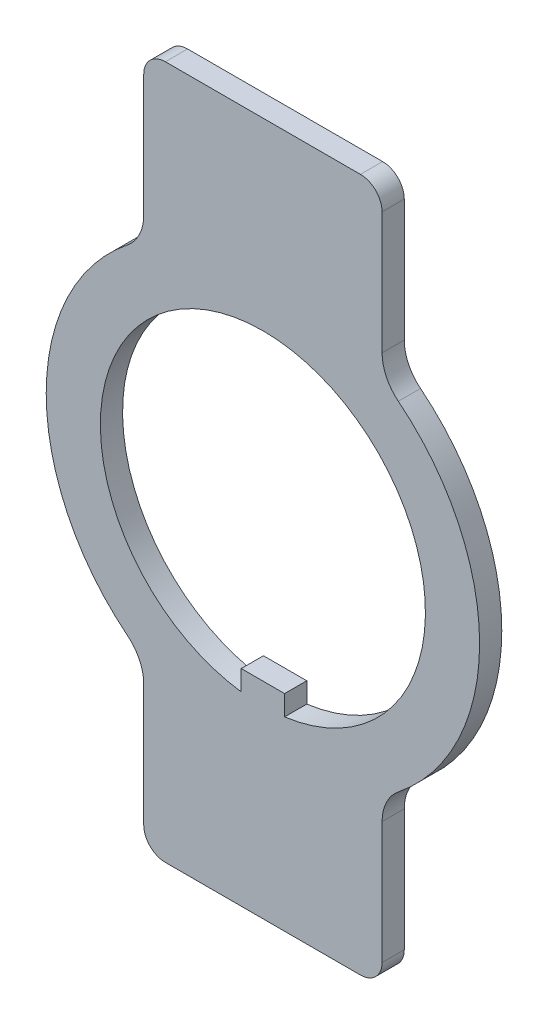
ISO-10303-21;
HEADER;
FILE_DESCRIPTION(('STEP AP214'),'2;1');
FILE_NAME('part.step','',(''),(''),'','','');
FILE_SCHEMA(('AUTOMOTIVE_DESIGN { 1 0 10303 214 1 1 1 1 }'));
ENDSEC;
DATA;
#1=APPLICATION_CONTEXT('core data for automotive mechanical design processes');
#2=APPLICATION_PROTOCOL_DEFINITION('international standard','automotive_design',2000,#1);
#3=PRODUCT_CONTEXT('',#1,'mechanical');
#4=PRODUCT('Part','Part','',(#3));
#5=PRODUCT_RELATED_PRODUCT_CATEGORY('part','',(#4));
#6=PRODUCT_DEFINITION_FORMATION('','',#4);
#7=PRODUCT_DEFINITION_CONTEXT('part definition',#1,'design');
#8=PRODUCT_DEFINITION('design','',#6,#7);
#9=PRODUCT_DEFINITION_SHAPE('','',#8);
#10=(LENGTH_UNIT() NAMED_UNIT(*) SI_UNIT(.MILLI.,.METRE.));
#11=(NAMED_UNIT(*) PLANE_ANGLE_UNIT() SI_UNIT($,.RADIAN.));
#12=(NAMED_UNIT(*) SI_UNIT($,.STERADIAN.) SOLID_ANGLE_UNIT());
#13=UNCERTAINTY_MEASURE_WITH_UNIT(LENGTH_MEASURE(1.E-05),#10,'distance_accuracy_value','');
#14=(GEOMETRIC_REPRESENTATION_CONTEXT(3) GLOBAL_UNCERTAINTY_ASSIGNED_CONTEXT((#13)) GLOBAL_UNIT_ASSIGNED_CONTEXT((#10,
#11,#12)) REPRESENTATION_CONTEXT('',''));
#15=CARTESIAN_POINT('',(0.,0.,0.));
#16=DIRECTION('',(0.,0.,1.));
#17=DIRECTION('',(1.,0.,0.));
#18=AXIS2_PLACEMENT_3D('',#15,#16,#17);
#19=CARTESIAN_POINT('',(0.,0.,0.8128));
#20=DIRECTION('',(0.,0.,1.));
#21=DIRECTION('',(1.,0.,0.));
#22=AXIS2_PLACEMENT_3D('',#19,#20,#21);
#23=PLANE('',#22);
#24=DIRECTION('',(-1.,0.,0.));
#25=VECTOR('',#24,1.);
#26=CARTESIAN_POINT('',(-4.365625,12.7,0.8128));
#27=LINE('',#26,#25);
#28=CARTESIAN_POINT('',(3.571875,12.7,0.8128));
#29=VERTEX_POINT('',#28);
#30=CARTESIAN_POINT('',(-3.571875,12.7,0.8128));
#31=VERTEX_POINT('',#30);
#32=EDGE_CURVE('E255',#29,#31,#27,.T.);
#33=ORIENTED_EDGE('',*,*,#32,.T.);
#34=CARTESIAN_POINT('',(-3.571875,11.90625,0.8128));
#35=DIRECTION('',(0.,0.,1.));
#36=DIRECTION('',(1.,0.,0.));
#37=AXIS2_PLACEMENT_3D('',#34,#35,#36);
#38=CIRCLE('',#37,0.79375);
#39=CARTESIAN_POINT('',(-4.365625,11.90625,0.8128));
#40=VERTEX_POINT('',#39);
#41=EDGE_CURVE('E302',#31,#40,#38,.T.);
#42=ORIENTED_EDGE('',*,*,#41,.T.);
#43=DIRECTION('',(0.,-1.,0.));
#44=VECTOR('',#43,1.);
#45=CARTESIAN_POINT('',(-4.365625,12.7,0.8128));
#46=LINE('',#45,#44);
#47=CARTESIAN_POINT('',(-4.365625,7.4354507418431,0.8128));
#48=VERTEX_POINT('',#47);
#49=EDGE_CURVE('E236',#40,#48,#46,.T.);
#50=ORIENTED_EDGE('',*,*,#49,.T.);
#51=CARTESIAN_POINT('',(-5.953125,7.43545074184309,0.8128));
#52=DIRECTION('',(0.,0.,1.));
#53=DIRECTION('',(1.,0.,0.));
#54=AXIS2_PLACEMENT_3D('',#51,#52,#53);
#55=CIRCLE('',#54,1.5875);
#56=CARTESIAN_POINT('',(-4.9609375,6.19620895153591,0.8128));
#57=VERTEX_POINT('',#56);
#58=EDGE_CURVE('E339',#48,#57,#55,.F.);
#59=ORIENTED_EDGE('',*,*,#58,.T.);
#60=CARTESIAN_POINT('',(0.,0.,0.8128));
#61=DIRECTION('',(0.,0.,1.));
#62=DIRECTION('',(1.,0.,0.));
#63=AXIS2_PLACEMENT_3D('',#60,#61,#62);
#64=CIRCLE('',#63,7.9375);
#65=CARTESIAN_POINT('',(-4.9609375,-6.19620895153591,0.8128));
#66=VERTEX_POINT('',#65);
#67=EDGE_CURVE('E239',#57,#66,#64,.T.);
#68=ORIENTED_EDGE('',*,*,#67,.T.);
#69=CARTESIAN_POINT('',(-5.953125,-7.43545074184309,0.8128));
#70=DIRECTION('',(0.,0.,1.));
#71=DIRECTION('',(1.,0.,0.));
#72=AXIS2_PLACEMENT_3D('',#69,#70,#71);
#73=CIRCLE('',#72,1.5875);
#74=CARTESIAN_POINT('',(-4.365625,-7.43545074184309,0.8128));
#75=VERTEX_POINT('',#74);
#76=EDGE_CURVE('E14',#66,#75,#73,.F.);
#77=ORIENTED_EDGE('',*,*,#76,.T.);
#78=DIRECTION('',(0.,-1.,0.));
#79=VECTOR('',#78,1.);
#80=CARTESIAN_POINT('',(-4.365625,-6.62911944449449,0.8128));
#81=LINE('',#80,#79);
#82=CARTESIAN_POINT('',(-4.365625,-11.90625,0.8128));
#83=VERTEX_POINT('',#82);
#84=EDGE_CURVE('E242',#75,#83,#81,.T.);
#85=ORIENTED_EDGE('',*,*,#84,.T.);
#86=CARTESIAN_POINT('',(-3.571875,-11.90625,0.8128));
#87=DIRECTION('',(0.,0.,1.));
#88=DIRECTION('',(1.,0.,0.));
#89=AXIS2_PLACEMENT_3D('',#86,#87,#88);
#90=CIRCLE('',#89,0.79375);
#91=CARTESIAN_POINT('',(-3.571875,-12.7,0.8128));
#92=VERTEX_POINT('',#91);
#93=EDGE_CURVE('E296',#83,#92,#90,.T.);
#94=ORIENTED_EDGE('',*,*,#93,.T.);
#95=DIRECTION('',(1.,0.,0.));
#96=VECTOR('',#95,1.);
#97=CARTESIAN_POINT('',(-4.365625,-12.7,0.8128));
#98=LINE('',#97,#96);
#99=CARTESIAN_POINT('',(3.571875,-12.7,0.8128));
#100=VERTEX_POINT('',#99);
#101=EDGE_CURVE('E244',#92,#100,#98,.T.);
#102=ORIENTED_EDGE('',*,*,#101,.T.);
#103=CARTESIAN_POINT('',(3.571875,-11.90625,0.8128));
#104=DIRECTION('',(0.,0.,1.));
#105=DIRECTION('',(1.,0.,0.));
#106=AXIS2_PLACEMENT_3D('',#103,#104,#105);
#107=CIRCLE('',#106,0.79375);
#108=CARTESIAN_POINT('',(4.365625,-11.90625,0.8128));
#109=VERTEX_POINT('',#108);
#110=EDGE_CURVE('E298',#100,#109,#107,.T.);
#111=ORIENTED_EDGE('',*,*,#110,.T.);
#112=DIRECTION('',(0.,1.,0.));
#113=VECTOR('',#112,1.);
#114=CARTESIAN_POINT('',(4.365625,-12.7,0.8128));
#115=LINE('',#114,#113);
#116=CARTESIAN_POINT('',(4.365625,-7.43545074184309,0.8128));
#117=VERTEX_POINT('',#116);
#118=EDGE_CURVE('E247',#109,#117,#115,.T.);
#119=ORIENTED_EDGE('',*,*,#118,.T.);
#120=CARTESIAN_POINT('',(5.953125,-7.43545074184309,0.8128));
#121=DIRECTION('',(0.,0.,1.));
#122=DIRECTION('',(1.,0.,0.));
#123=AXIS2_PLACEMENT_3D('',#120,#121,#122);
#124=CIRCLE('',#123,1.5875);
#125=CARTESIAN_POINT('',(4.9609375,-6.19620895153591,0.8128));
#126=VERTEX_POINT('',#125);
#127=EDGE_CURVE('E347',#117,#126,#124,.F.);
#128=ORIENTED_EDGE('',*,*,#127,.T.);
#129=CARTESIAN_POINT('',(0.,0.,0.8128));
#130=DIRECTION('',(0.,0.,1.));
#131=DIRECTION('',(1.,0.,0.));
#132=AXIS2_PLACEMENT_3D('',#129,#130,#131);
#133=CIRCLE('',#132,7.9375);
#134=CARTESIAN_POINT('',(4.9609375,6.19620895153591,0.8128));
#135=VERTEX_POINT('',#134);
#136=EDGE_CURVE('E250',#126,#135,#133,.T.);
#137=ORIENTED_EDGE('',*,*,#136,.T.);
#138=CARTESIAN_POINT('',(5.953125,7.43545074184309,0.8128));
#139=DIRECTION('',(0.,0.,1.));
#140=DIRECTION('',(1.,0.,0.));
#141=AXIS2_PLACEMENT_3D('',#138,#139,#140);
#142=CIRCLE('',#141,1.5875);
#143=CARTESIAN_POINT('',(4.365625,7.43545074184309,0.8128));
#144=VERTEX_POINT('',#143);
#145=EDGE_CURVE('E343',#135,#144,#142,.F.);
#146=ORIENTED_EDGE('',*,*,#145,.T.);
#147=DIRECTION('',(0.,1.,0.));
#148=VECTOR('',#147,1.);
#149=CARTESIAN_POINT('',(4.365625,6.6291194444945,0.8128));
#150=LINE('',#149,#148);
#151=CARTESIAN_POINT('',(4.365625,11.90625,0.8128));
#152=VERTEX_POINT('',#151);
#153=EDGE_CURVE('E253',#144,#152,#150,.T.);
#154=ORIENTED_EDGE('',*,*,#153,.T.);
#155=CARTESIAN_POINT('',(3.571875,11.90625,0.8128));
#156=DIRECTION('',(0.,0.,1.));
#157=DIRECTION('',(1.,0.,0.));
#158=AXIS2_PLACEMENT_3D('',#155,#156,#157);
#159=CIRCLE('',#158,0.79375);
#160=EDGE_CURVE('E300',#152,#29,#159,.T.);
#161=ORIENTED_EDGE('',*,*,#160,.T.);
#162=EDGE_LOOP('',(#33,#42,#50,#59,#68,#77,#85,#94,#102,#111,#119,#128,#137,#146,#154,#161));
#163=FACE_BOUND('',#162,.T.);
#164=DIRECTION('',(0.,1.,0.));
#165=VECTOR('',#164,1.);
#166=CARTESIAN_POINT('',(-0.793749999999996,-5.89997103409203,0.8128));
#167=LINE('',#166,#165);
#168=CARTESIAN_POINT('',(-0.793749999999996,-5.89997103409203,0.8128));
#169=VERTEX_POINT('',#168);
#170=CARTESIAN_POINT('',(-0.793749999999996,-5.159375,0.8128));
#171=VERTEX_POINT('',#170);
#172=EDGE_CURVE('E205',#169,#171,#167,.T.);
#173=ORIENTED_EDGE('',*,*,#172,.F.);
#174=CARTESIAN_POINT('',(0.,0.,0.8128));
#175=DIRECTION('',(0.,0.,1.));
#176=DIRECTION('',(-1.,0.,0.));
#177=AXIS2_PLACEMENT_3D('',#174,#175,#176);
#178=CIRCLE('',#177,5.953125);
#179=CARTESIAN_POINT('',(0.793750000000004,-5.89997103409203,0.8128));
#180=VERTEX_POINT('',#179);
#181=EDGE_CURVE('E195',#180,#169,#178,.T.);
#182=ORIENTED_EDGE('',*,*,#181,.F.);
#183=DIRECTION('',(0.,-1.,0.));
#184=VECTOR('',#183,1.);
#185=CARTESIAN_POINT('',(0.793750000000004,-5.159375,0.8128));
#186=LINE('',#185,#184);
#187=CARTESIAN_POINT('',(0.793750000000004,-5.159375,0.8128));
#188=VERTEX_POINT('',#187);
#189=EDGE_CURVE('E220',#188,#180,#186,.T.);
#190=ORIENTED_EDGE('',*,*,#189,.F.);
#191=DIRECTION('',(1.,0.,0.));
#192=VECTOR('',#191,1.);
#193=CARTESIAN_POINT('',(-0.793749999999996,-5.159375,0.8128));
#194=LINE('',#193,#192);
#195=EDGE_CURVE('E218',#171,#188,#194,.T.);
#196=ORIENTED_EDGE('',*,*,#195,.F.);
#197=EDGE_LOOP('',(#173,#182,#190,#196));
#198=FACE_BOUND('',#197,.T.);
#199=ADVANCED_FACE('F58',(#163,#198),#23,.T.);
#200=CARTESIAN_POINT('',(0.,0.,0.));
#201=DIRECTION('',(0.,0.,1.));
#202=DIRECTION('',(1.,0.,0.));
#203=AXIS2_PLACEMENT_3D('',#200,#201,#202);
#204=PLANE('',#203);
#205=DIRECTION('',(0.,-1.,0.));
#206=VECTOR('',#205,1.);
#207=CARTESIAN_POINT('',(-4.365625,12.7,0.));
#208=LINE('',#207,#206);
#209=CARTESIAN_POINT('',(-4.365625,11.90625,0.));
#210=VERTEX_POINT('',#209);
#211=CARTESIAN_POINT('',(-4.365625,7.4354507418431,0.));
#212=VERTEX_POINT('',#211);
#213=EDGE_CURVE('E213',#210,#212,#208,.T.);
#214=ORIENTED_EDGE('',*,*,#213,.F.);
#215=CARTESIAN_POINT('',(-3.571875,11.90625,0.));
#216=DIRECTION('',(0.,0.,1.));
#217=DIRECTION('',(1.,0.,0.));
#218=AXIS2_PLACEMENT_3D('',#215,#216,#217);
#219=CIRCLE('',#218,0.79375);
#220=CARTESIAN_POINT('',(-3.571875,12.7,0.));
#221=VERTEX_POINT('',#220);
#222=EDGE_CURVE('E289',#210,#221,#219,.F.);
#223=ORIENTED_EDGE('',*,*,#222,.T.);
#224=DIRECTION('',(-1.,0.,0.));
#225=VECTOR('',#224,1.);
#226=CARTESIAN_POINT('',(-4.365625,12.7,0.));
#227=LINE('',#226,#225);
#228=CARTESIAN_POINT('',(3.571875,12.7,0.));
#229=VERTEX_POINT('',#228);
#230=EDGE_CURVE('E240',#229,#221,#227,.T.);
#231=ORIENTED_EDGE('',*,*,#230,.F.);
#232=CARTESIAN_POINT('',(3.571875,11.90625,0.));
#233=DIRECTION('',(0.,0.,1.));
#234=DIRECTION('',(1.,0.,0.));
#235=AXIS2_PLACEMENT_3D('',#232,#233,#234);
#236=CIRCLE('',#235,0.79375);
#237=CARTESIAN_POINT('',(4.365625,11.90625,0.));
#238=VERTEX_POINT('',#237);
#239=EDGE_CURVE('E286',#229,#238,#236,.F.);
#240=ORIENTED_EDGE('',*,*,#239,.T.);
#241=DIRECTION('',(0.,1.,0.));
#242=VECTOR('',#241,1.);
#243=CARTESIAN_POINT('',(4.365625,6.6291194444945,0.));
#244=LINE('',#243,#242);
#245=CARTESIAN_POINT('',(4.365625,7.43545074184309,0.));
#246=VERTEX_POINT('',#245);
#247=EDGE_CURVE('E275',#246,#238,#244,.T.);
#248=ORIENTED_EDGE('',*,*,#247,.F.);
#249=CARTESIAN_POINT('',(5.953125,7.43545074184309,0.));
#250=DIRECTION('',(0.,0.,1.));
#251=DIRECTION('',(1.,0.,0.));
#252=AXIS2_PLACEMENT_3D('',#249,#250,#251);
#253=CIRCLE('',#252,1.5875);
#254=CARTESIAN_POINT('',(4.9609375,6.19620895153591,0.));
#255=VERTEX_POINT('',#254);
#256=EDGE_CURVE('E341',#246,#255,#253,.T.);
#257=ORIENTED_EDGE('',*,*,#256,.T.);
#258=CARTESIAN_POINT('',(0.,0.,0.));
#259=DIRECTION('',(0.,0.,1.));
#260=DIRECTION('',(1.,0.,0.));
#261=AXIS2_PLACEMENT_3D('',#258,#259,#260);
#262=CIRCLE('',#261,7.9375);
#263=CARTESIAN_POINT('',(4.9609375,-6.19620895153591,0.));
#264=VERTEX_POINT('',#263);
#265=EDGE_CURVE('E272',#264,#255,#262,.T.);
#266=ORIENTED_EDGE('',*,*,#265,.F.);
#267=CARTESIAN_POINT('',(5.953125,-7.43545074184309,0.));
#268=DIRECTION('',(0.,0.,1.));
#269=DIRECTION('',(1.,0.,0.));
#270=AXIS2_PLACEMENT_3D('',#267,#268,#269);
#271=CIRCLE('',#270,1.5875);
#272=CARTESIAN_POINT('',(4.365625,-7.43545074184309,0.));
#273=VERTEX_POINT('',#272);
#274=EDGE_CURVE('E345',#264,#273,#271,.T.);
#275=ORIENTED_EDGE('',*,*,#274,.T.);
#276=DIRECTION('',(0.,1.,0.));
#277=VECTOR('',#276,1.);
#278=CARTESIAN_POINT('',(4.365625,-12.7,0.));
#279=LINE('',#278,#277);
#280=CARTESIAN_POINT('',(4.365625,-11.90625,0.));
#281=VERTEX_POINT('',#280);
#282=EDGE_CURVE('E269',#281,#273,#279,.T.);
#283=ORIENTED_EDGE('',*,*,#282,.F.);
#284=CARTESIAN_POINT('',(3.571875,-11.90625,0.));
#285=DIRECTION('',(0.,0.,1.));
#286=DIRECTION('',(1.,0.,0.));
#287=AXIS2_PLACEMENT_3D('',#284,#285,#286);
#288=CIRCLE('',#287,0.79375);
#289=CARTESIAN_POINT('',(3.571875,-12.7,0.));
#290=VERTEX_POINT('',#289);
#291=EDGE_CURVE('E284',#281,#290,#288,.F.);
#292=ORIENTED_EDGE('',*,*,#291,.T.);
#293=DIRECTION('',(1.,0.,0.));
#294=VECTOR('',#293,1.);
#295=CARTESIAN_POINT('',(-4.365625,-12.7,0.));
#296=LINE('',#295,#294);
#297=CARTESIAN_POINT('',(-3.571875,-12.7,0.));
#298=VERTEX_POINT('',#297);
#299=EDGE_CURVE('E266',#298,#290,#296,.T.);
#300=ORIENTED_EDGE('',*,*,#299,.F.);
#301=CARTESIAN_POINT('',(-3.571875,-11.90625,0.));
#302=DIRECTION('',(0.,0.,1.));
#303=DIRECTION('',(1.,0.,0.));
#304=AXIS2_PLACEMENT_3D('',#301,#302,#303);
#305=CIRCLE('',#304,0.79375);
#306=CARTESIAN_POINT('',(-4.365625,-11.90625,0.));
#307=VERTEX_POINT('',#306);
#308=EDGE_CURVE('E281',#298,#307,#305,.F.);
#309=ORIENTED_EDGE('',*,*,#308,.T.);
#310=DIRECTION('',(0.,-1.,0.));
#311=VECTOR('',#310,1.);
#312=CARTESIAN_POINT('',(-4.365625,-6.62911944449449,0.));
#313=LINE('',#312,#311);
#314=CARTESIAN_POINT('',(-4.365625,-7.43545074184309,0.));
#315=VERTEX_POINT('',#314);
#316=EDGE_CURVE('E264',#315,#307,#313,.T.);
#317=ORIENTED_EDGE('',*,*,#316,.F.);
#318=CARTESIAN_POINT('',(-5.953125,-7.43545074184309,0.));
#319=DIRECTION('',(0.,0.,1.));
#320=DIRECTION('',(1.,0.,0.));
#321=AXIS2_PLACEMENT_3D('',#318,#319,#320);
#322=CIRCLE('',#321,1.5875);
#323=CARTESIAN_POINT('',(-4.9609375,-6.19620895153591,0.));
#324=VERTEX_POINT('',#323);
#325=EDGE_CURVE('E66',#315,#324,#322,.T.);
#326=ORIENTED_EDGE('',*,*,#325,.T.);
#327=CARTESIAN_POINT('',(0.,0.,0.));
#328=DIRECTION('',(0.,0.,1.));
#329=DIRECTION('',(1.,0.,0.));
#330=AXIS2_PLACEMENT_3D('',#327,#328,#329);
#331=CIRCLE('',#330,7.9375);
#332=CARTESIAN_POINT('',(-4.9609375,6.19620895153591,0.));
#333=VERTEX_POINT('',#332);
#334=EDGE_CURVE('E261',#333,#324,#331,.T.);
#335=ORIENTED_EDGE('',*,*,#334,.F.);
#336=CARTESIAN_POINT('',(-5.953125,7.43545074184309,0.));
#337=DIRECTION('',(0.,0.,1.));
#338=DIRECTION('',(1.,0.,0.));
#339=AXIS2_PLACEMENT_3D('',#336,#337,#338);
#340=CIRCLE('',#339,1.5875);
#341=EDGE_CURVE('E337',#333,#212,#340,.T.);
#342=ORIENTED_EDGE('',*,*,#341,.T.);
#343=EDGE_LOOP('',(#214,#223,#231,#240,#248,#257,#266,#275,#283,#292,#300,#309,#317,#326,#335,#342));
#344=FACE_BOUND('',#343,.T.);
#345=CARTESIAN_POINT('',(0.,0.,0.));
#346=DIRECTION('',(0.,0.,1.));
#347=DIRECTION('',(-1.,0.,0.));
#348=AXIS2_PLACEMENT_3D('',#345,#346,#347);
#349=CIRCLE('',#348,5.953125);
#350=CARTESIAN_POINT('',(0.793750000000004,-5.89997103409203,0.));
#351=VERTEX_POINT('',#350);
#352=CARTESIAN_POINT('',(-0.793749999999996,-5.89997103409203,0.));
#353=VERTEX_POINT('',#352);
#354=EDGE_CURVE('E224',#351,#353,#349,.T.);
#355=ORIENTED_EDGE('',*,*,#354,.T.);
#356=DIRECTION('',(0.,1.,0.));
#357=VECTOR('',#356,1.);
#358=CARTESIAN_POINT('',(-0.793749999999996,-5.89997103409203,0.));
#359=LINE('',#358,#357);
#360=CARTESIAN_POINT('',(-0.793749999999996,-5.159375,0.));
#361=VERTEX_POINT('',#360);
#362=EDGE_CURVE('E212',#353,#361,#359,.T.);
#363=ORIENTED_EDGE('',*,*,#362,.T.);
#364=DIRECTION('',(1.,0.,0.));
#365=VECTOR('',#364,1.);
#366=CARTESIAN_POINT('',(-0.793749999999996,-5.159375,0.));
#367=LINE('',#366,#365);
#368=CARTESIAN_POINT('',(0.793750000000004,-5.159375,0.));
#369=VERTEX_POINT('',#368);
#370=EDGE_CURVE('E227',#361,#369,#367,.T.);
#371=ORIENTED_EDGE('',*,*,#370,.T.);
#372=DIRECTION('',(0.,-1.,0.));
#373=VECTOR('',#372,1.);
#374=CARTESIAN_POINT('',(0.793750000000004,-5.159375,0.));
#375=LINE('',#374,#373);
#376=EDGE_CURVE('E206',#369,#351,#375,.T.);
#377=ORIENTED_EDGE('',*,*,#376,.T.);
#378=EDGE_LOOP('',(#355,#363,#371,#377));
#379=FACE_BOUND('',#378,.T.);
#380=ADVANCED_FACE('F352',(#344,#379),#204,.F.);
#381=CARTESIAN_POINT('',(-4.365625,12.7,0.8128));
#382=DIRECTION('',(1.,0.,0.));
#383=DIRECTION('',(0.,1.,0.));
#384=AXIS2_PLACEMENT_3D('',#381,#382,#383);
#385=PLANE('',#384);
#386=ORIENTED_EDGE('',*,*,#213,.T.);
#387=DIRECTION('',(0.,0.,1.));
#388=VECTOR('',#387,1.);
#389=CARTESIAN_POINT('',(-4.365625,7.43545074184309,0.8128));
#390=LINE('',#389,#388);
#391=EDGE_CURVE('E323',#212,#48,#390,.T.);
#392=ORIENTED_EDGE('',*,*,#391,.T.);
#393=ORIENTED_EDGE('',*,*,#49,.F.);
#394=DIRECTION('',(0.,0.,-1.));
#395=VECTOR('',#394,1.);
#396=CARTESIAN_POINT('',(-4.365625,11.90625,0.8128));
#397=LINE('',#396,#395);
#398=EDGE_CURVE('E258',#40,#210,#397,.T.);
#399=ORIENTED_EDGE('',*,*,#398,.T.);
#400=EDGE_LOOP('',(#386,#392,#393,#399));
#401=FACE_BOUND('',#400,.T.);
#402=ADVANCED_FACE('F413',(#401),#385,.F.);
#403=CARTESIAN_POINT('',(0.,0.,0.8128));
#404=DIRECTION('',(0.,0.,-1.));
#405=DIRECTION('',(-1.,0.,0.));
#406=AXIS2_PLACEMENT_3D('',#403,#404,#405);
#407=CYLINDRICAL_SURFACE('',#406,7.9375);
#408=ORIENTED_EDGE('',*,*,#67,.F.);
#409=DIRECTION('',(0.,0.,-1.));
#410=VECTOR('',#409,1.);
#411=CARTESIAN_POINT('',(-4.9609375,6.19620895153591,0.8128));
#412=LINE('',#411,#410);
#413=EDGE_CURVE('E320',#57,#333,#412,.T.);
#414=ORIENTED_EDGE('',*,*,#413,.T.);
#415=ORIENTED_EDGE('',*,*,#334,.T.);
#416=DIRECTION('',(0.,0.,-1.));
#417=VECTOR('',#416,1.);
#418=CARTESIAN_POINT('',(-4.9609375,-6.19620895153591,0.8128));
#419=LINE('',#418,#417);
#420=EDGE_CURVE('E318',#324,#66,#419,.F.);
#421=ORIENTED_EDGE('',*,*,#420,.T.);
#422=EDGE_LOOP('',(#408,#414,#415,#421));
#423=FACE_BOUND('',#422,.T.);
#424=ADVANCED_FACE('F356',(#423),#407,.T.);
#425=CARTESIAN_POINT('',(-4.365625,-6.62911944449449,0.8128));
#426=DIRECTION('',(1.,0.,0.));
#427=DIRECTION('',(0.,1.,0.));
#428=AXIS2_PLACEMENT_3D('',#425,#426,#427);
#429=PLANE('',#428);
#430=ORIENTED_EDGE('',*,*,#84,.F.);
#431=DIRECTION('',(0.,0.,1.));
#432=VECTOR('',#431,1.);
#433=CARTESIAN_POINT('',(-4.365625,-7.43545074184309,0.));
#434=LINE('',#433,#432);
#435=EDGE_CURVE('E335',#75,#315,#434,.F.);
#436=ORIENTED_EDGE('',*,*,#435,.T.);
#437=ORIENTED_EDGE('',*,*,#316,.T.);
#438=DIRECTION('',(0.,0.,-1.));
#439=VECTOR('',#438,1.);
#440=CARTESIAN_POINT('',(-4.365625,-11.90625,0.8128));
#441=LINE('',#440,#439);
#442=EDGE_CURVE('E315',#307,#83,#441,.F.);
#443=ORIENTED_EDGE('',*,*,#442,.T.);
#444=EDGE_LOOP('',(#430,#436,#437,#443));
#445=FACE_BOUND('',#444,.T.);
#446=ADVANCED_FACE('F359',(#445),#429,.F.);
#447=CARTESIAN_POINT('',(-4.365625,-12.7,0.8128));
#448=DIRECTION('',(0.,1.,0.));
#449=DIRECTION('',(-1.,0.,0.));
#450=AXIS2_PLACEMENT_3D('',#447,#448,#449);
#451=PLANE('',#450);
#452=ORIENTED_EDGE('',*,*,#299,.T.);
#453=DIRECTION('',(0.,0.,-1.));
#454=VECTOR('',#453,1.);
#455=CARTESIAN_POINT('',(3.571875,-12.7,0.8128));
#456=LINE('',#455,#454);
#457=EDGE_CURVE('E313',#290,#100,#456,.F.);
#458=ORIENTED_EDGE('',*,*,#457,.T.);
#459=ORIENTED_EDGE('',*,*,#101,.F.);
#460=DIRECTION('',(0.,0.,-1.));
#461=VECTOR('',#460,1.);
#462=CARTESIAN_POINT('',(-3.571875,-12.7,0.8128));
#463=LINE('',#462,#461);
#464=EDGE_CURVE('E310',#92,#298,#463,.T.);
#465=ORIENTED_EDGE('',*,*,#464,.T.);
#466=EDGE_LOOP('',(#452,#458,#459,#465));
#467=FACE_BOUND('',#466,.T.);
#468=ADVANCED_FACE('F367',(#467),#451,.F.);
#469=CARTESIAN_POINT('',(4.365625,-12.7,0.8128));
#470=DIRECTION('',(-1.,0.,0.));
#471=DIRECTION('',(0.,-1.,0.));
#472=AXIS2_PLACEMENT_3D('',#469,#470,#471);
#473=PLANE('',#472);
#474=ORIENTED_EDGE('',*,*,#282,.T.);
#475=DIRECTION('',(0.,0.,1.));
#476=VECTOR('',#475,1.);
#477=CARTESIAN_POINT('',(4.365625,-7.43545074184309,0.8128));
#478=LINE('',#477,#476);
#479=EDGE_CURVE('E333',#273,#117,#478,.T.);
#480=ORIENTED_EDGE('',*,*,#479,.T.);
#481=ORIENTED_EDGE('',*,*,#118,.F.);
#482=DIRECTION('',(0.,0.,-1.));
#483=VECTOR('',#482,1.);
#484=CARTESIAN_POINT('',(4.365625,-11.90625,0.8128));
#485=LINE('',#484,#483);
#486=EDGE_CURVE('E307',#109,#281,#485,.T.);
#487=ORIENTED_EDGE('',*,*,#486,.T.);
#488=EDGE_LOOP('',(#474,#480,#481,#487));
#489=FACE_BOUND('',#488,.T.);
#490=ADVANCED_FACE('F378',(#489),#473,.F.);
#491=CARTESIAN_POINT('',(0.,0.,0.8128));
#492=DIRECTION('',(0.,0.,-1.));
#493=DIRECTION('',(-1.,0.,0.));
#494=AXIS2_PLACEMENT_3D('',#491,#492,#493);
#495=CYLINDRICAL_SURFACE('',#494,7.9375);
#496=ORIENTED_EDGE('',*,*,#265,.T.);
#497=DIRECTION('',(0.,0.,-1.));
#498=VECTOR('',#497,1.);
#499=CARTESIAN_POINT('',(4.9609375,6.19620895153591,0.8128));
#500=LINE('',#499,#498);
#501=EDGE_CURVE('E331',#255,#135,#500,.F.);
#502=ORIENTED_EDGE('',*,*,#501,.T.);
#503=ORIENTED_EDGE('',*,*,#136,.F.);
#504=DIRECTION('',(0.,0.,-1.));
#505=VECTOR('',#504,1.);
#506=CARTESIAN_POINT('',(4.9609375,-6.19620895153591,0.8128));
#507=LINE('',#506,#505);
#508=EDGE_CURVE('E328',#126,#264,#507,.T.);
#509=ORIENTED_EDGE('',*,*,#508,.T.);
#510=EDGE_LOOP('',(#496,#502,#503,#509));
#511=FACE_BOUND('',#510,.T.);
#512=ADVANCED_FACE('F386',(#511),#495,.T.);
#513=CARTESIAN_POINT('',(4.365625,6.6291194444945,0.8128));
#514=DIRECTION('',(-1.,0.,0.));
#515=DIRECTION('',(0.,-1.,0.));
#516=AXIS2_PLACEMENT_3D('',#513,#514,#515);
#517=PLANE('',#516);
#518=ORIENTED_EDGE('',*,*,#153,.F.);
#519=DIRECTION('',(0.,0.,1.));
#520=VECTOR('',#519,1.);
#521=CARTESIAN_POINT('',(4.365625,7.43545074184309,0.));
#522=LINE('',#521,#520);
#523=EDGE_CURVE('E325',#144,#246,#522,.F.);
#524=ORIENTED_EDGE('',*,*,#523,.T.);
#525=ORIENTED_EDGE('',*,*,#247,.T.);
#526=DIRECTION('',(0.,0.,-1.));
#527=VECTOR('',#526,1.);
#528=CARTESIAN_POINT('',(4.365625,11.90625,0.8128));
#529=LINE('',#528,#527);
#530=EDGE_CURVE('E304',#238,#152,#529,.F.);
#531=ORIENTED_EDGE('',*,*,#530,.T.);
#532=EDGE_LOOP('',(#518,#524,#525,#531));
#533=FACE_BOUND('',#532,.T.);
#534=ADVANCED_FACE('F394',(#533),#517,.F.);
#535=CARTESIAN_POINT('',(-4.365625,12.7,0.8128));
#536=DIRECTION('',(0.,-1.,0.));
#537=DIRECTION('',(1.,0.,0.));
#538=AXIS2_PLACEMENT_3D('',#535,#536,#537);
#539=PLANE('',#538);
#540=ORIENTED_EDGE('',*,*,#230,.T.);
#541=DIRECTION('',(0.,0.,-1.));
#542=VECTOR('',#541,1.);
#543=CARTESIAN_POINT('',(-3.571875,12.7,0.8128));
#544=LINE('',#543,#542);
#545=EDGE_CURVE('E294',#221,#31,#544,.F.);
#546=ORIENTED_EDGE('',*,*,#545,.T.);
#547=ORIENTED_EDGE('',*,*,#32,.F.);
#548=DIRECTION('',(0.,0.,-1.));
#549=VECTOR('',#548,1.);
#550=CARTESIAN_POINT('',(3.571875,12.7,0.8128));
#551=LINE('',#550,#549);
#552=EDGE_CURVE('E291',#29,#229,#551,.T.);
#553=ORIENTED_EDGE('',*,*,#552,.T.);
#554=EDGE_LOOP('',(#540,#546,#547,#553));
#555=FACE_BOUND('',#554,.T.);
#556=ADVANCED_FACE('F404',(#555),#539,.F.);
#557=CARTESIAN_POINT('',(0.,0.,0.8128));
#558=DIRECTION('',(0.,0.,-1.));
#559=DIRECTION('',(-1.,0.,0.));
#560=AXIS2_PLACEMENT_3D('',#557,#558,#559);
#561=CYLINDRICAL_SURFACE('',#560,5.953125);
#562=ORIENTED_EDGE('',*,*,#354,.F.);
#563=DIRECTION('',(0.,0.,-1.));
#564=VECTOR('',#563,1.);
#565=CARTESIAN_POINT('',(0.793750000000004,-5.89997103409203,0.8128));
#566=LINE('',#565,#564);
#567=EDGE_CURVE('E201',#180,#351,#566,.T.);
#568=ORIENTED_EDGE('',*,*,#567,.F.);
#569=ORIENTED_EDGE('',*,*,#181,.T.);
#570=DIRECTION('',(0.,0.,-1.));
#571=VECTOR('',#570,1.);
#572=CARTESIAN_POINT('',(-0.793749999999996,-5.89997103409203,0.8128));
#573=LINE('',#572,#571);
#574=EDGE_CURVE('E198',#169,#353,#573,.T.);
#575=ORIENTED_EDGE('',*,*,#574,.T.);
#576=EDGE_LOOP('',(#562,#568,#569,#575));
#577=FACE_BOUND('',#576,.T.);
#578=ADVANCED_FACE('F197',(#577),#561,.F.);
#579=CARTESIAN_POINT('',(-0.793749999999996,-5.89997103409203,0.8128));
#580=DIRECTION('',(-1.,0.,0.));
#581=DIRECTION('',(0.,0.,1.));
#582=AXIS2_PLACEMENT_3D('',#579,#580,#581);
#583=PLANE('',#582);
#584=ORIENTED_EDGE('',*,*,#362,.F.);
#585=ORIENTED_EDGE('',*,*,#574,.F.);
#586=ORIENTED_EDGE('',*,*,#172,.T.);
#587=DIRECTION('',(0.,0.,-1.));
#588=VECTOR('',#587,1.);
#589=CARTESIAN_POINT('',(-0.793749999999996,-5.159375,0.8128));
#590=LINE('',#589,#588);
#591=EDGE_CURVE('E214',#171,#361,#590,.T.);
#592=ORIENTED_EDGE('',*,*,#591,.T.);
#593=EDGE_LOOP('',(#584,#585,#586,#592));
#594=FACE_BOUND('',#593,.T.);
#595=ADVANCED_FACE('F209',(#594),#583,.T.);
#596=CARTESIAN_POINT('',(-0.793749999999996,-5.159375,0.8128));
#597=DIRECTION('',(0.,1.,0.));
#598=DIRECTION('',(0.,0.,1.));
#599=AXIS2_PLACEMENT_3D('',#596,#597,#598);
#600=PLANE('',#599);
#601=ORIENTED_EDGE('',*,*,#370,.F.);
#602=ORIENTED_EDGE('',*,*,#591,.F.);
#603=ORIENTED_EDGE('',*,*,#195,.T.);
#604=DIRECTION('',(0.,0.,-1.));
#605=VECTOR('',#604,1.);
#606=CARTESIAN_POINT('',(0.793750000000004,-5.159375,0.8128));
#607=LINE('',#606,#605);
#608=EDGE_CURVE('E233',#188,#369,#607,.T.);
#609=ORIENTED_EDGE('',*,*,#608,.T.);
#610=EDGE_LOOP('',(#601,#602,#603,#609));
#611=FACE_BOUND('',#610,.T.);
#612=ADVANCED_FACE('F554',(#611),#600,.T.);
#613=CARTESIAN_POINT('',(0.793750000000004,-5.159375,0.8128));
#614=DIRECTION('',(1.,0.,0.));
#615=DIRECTION('',(0.,0.,-1.));
#616=AXIS2_PLACEMENT_3D('',#613,#614,#615);
#617=PLANE('',#616);
#618=ORIENTED_EDGE('',*,*,#376,.F.);
#619=ORIENTED_EDGE('',*,*,#608,.F.);
#620=ORIENTED_EDGE('',*,*,#189,.T.);
#621=ORIENTED_EDGE('',*,*,#567,.T.);
#622=EDGE_LOOP('',(#618,#619,#620,#621));
#623=FACE_BOUND('',#622,.T.);
#624=ADVANCED_FACE('F452',(#623),#617,.T.);
#625=CARTESIAN_POINT('',(-3.571875,11.90625,0.8128));
#626=DIRECTION('',(0.,0.,-1.));
#627=DIRECTION('',(-1.,0.,0.));
#628=AXIS2_PLACEMENT_3D('',#625,#626,#627);
#629=CYLINDRICAL_SURFACE('',#628,0.79375);
#630=ORIENTED_EDGE('',*,*,#41,.F.);
#631=ORIENTED_EDGE('',*,*,#545,.F.);
#632=ORIENTED_EDGE('',*,*,#222,.F.);
#633=ORIENTED_EDGE('',*,*,#398,.F.);
#634=EDGE_LOOP('',(#630,#631,#632,#633));
#635=FACE_BOUND('',#634,.T.);
#636=ADVANCED_FACE('F408',(#635),#629,.T.);
#637=CARTESIAN_POINT('',(3.571875,11.90625,0.8128));
#638=DIRECTION('',(0.,0.,-1.));
#639=DIRECTION('',(-1.,0.,0.));
#640=AXIS2_PLACEMENT_3D('',#637,#638,#639);
#641=CYLINDRICAL_SURFACE('',#640,0.79375);
#642=ORIENTED_EDGE('',*,*,#160,.F.);
#643=ORIENTED_EDGE('',*,*,#530,.F.);
#644=ORIENTED_EDGE('',*,*,#239,.F.);
#645=ORIENTED_EDGE('',*,*,#552,.F.);
#646=EDGE_LOOP('',(#642,#643,#644,#645));
#647=FACE_BOUND('',#646,.T.);
#648=ADVANCED_FACE('F400',(#647),#641,.T.);
#649=CARTESIAN_POINT('',(3.571875,-11.90625,0.8128));
#650=DIRECTION('',(0.,0.,-1.));
#651=DIRECTION('',(-1.,0.,0.));
#652=AXIS2_PLACEMENT_3D('',#649,#650,#651);
#653=CYLINDRICAL_SURFACE('',#652,0.79375);
#654=ORIENTED_EDGE('',*,*,#110,.F.);
#655=ORIENTED_EDGE('',*,*,#457,.F.);
#656=ORIENTED_EDGE('',*,*,#291,.F.);
#657=ORIENTED_EDGE('',*,*,#486,.F.);
#658=EDGE_LOOP('',(#654,#655,#656,#657));
#659=FACE_BOUND('',#658,.T.);
#660=ADVANCED_FACE('F373',(#659),#653,.T.);
#661=CARTESIAN_POINT('',(-3.571875,-11.90625,0.8128));
#662=DIRECTION('',(0.,0.,-1.));
#663=DIRECTION('',(-1.,0.,0.));
#664=AXIS2_PLACEMENT_3D('',#661,#662,#663);
#665=CYLINDRICAL_SURFACE('',#664,0.79375);
#666=ORIENTED_EDGE('',*,*,#93,.F.);
#667=ORIENTED_EDGE('',*,*,#442,.F.);
#668=ORIENTED_EDGE('',*,*,#308,.F.);
#669=ORIENTED_EDGE('',*,*,#464,.F.);
#670=EDGE_LOOP('',(#666,#667,#668,#669));
#671=FACE_BOUND('',#670,.T.);
#672=ADVANCED_FACE('F370',(#671),#665,.T.);
#673=CARTESIAN_POINT('',(-5.953125,7.43545074184309,0.8128));
#674=DIRECTION('',(0.,0.,-1.));
#675=DIRECTION('',(-1.,0.,0.));
#676=AXIS2_PLACEMENT_3D('',#673,#674,#675);
#677=CYLINDRICAL_SURFACE('',#676,1.5875);
#678=ORIENTED_EDGE('',*,*,#58,.F.);
#679=ORIENTED_EDGE('',*,*,#391,.F.);
#680=ORIENTED_EDGE('',*,*,#341,.F.);
#681=ORIENTED_EDGE('',*,*,#413,.F.);
#682=EDGE_LOOP('',(#678,#679,#680,#681));
#683=FACE_BOUND('',#682,.T.);
#684=ADVANCED_FACE('F416',(#683),#677,.F.);
#685=CARTESIAN_POINT('',(5.953125,7.43545074184309,0.8128));
#686=DIRECTION('',(0.,0.,-1.));
#687=DIRECTION('',(-1.,0.,0.));
#688=AXIS2_PLACEMENT_3D('',#685,#686,#687);
#689=CYLINDRICAL_SURFACE('',#688,1.5875);
#690=ORIENTED_EDGE('',*,*,#145,.F.);
#691=ORIENTED_EDGE('',*,*,#501,.F.);
#692=ORIENTED_EDGE('',*,*,#256,.F.);
#693=ORIENTED_EDGE('',*,*,#523,.F.);
#694=EDGE_LOOP('',(#690,#691,#692,#693));
#695=FACE_BOUND('',#694,.T.);
#696=ADVANCED_FACE('F390',(#695),#689,.F.);
#697=CARTESIAN_POINT('',(5.953125,-7.43545074184309,0.8128));
#698=DIRECTION('',(0.,0.,-1.));
#699=DIRECTION('',(-1.,0.,0.));
#700=AXIS2_PLACEMENT_3D('',#697,#698,#699);
#701=CYLINDRICAL_SURFACE('',#700,1.5875);
#702=ORIENTED_EDGE('',*,*,#127,.F.);
#703=ORIENTED_EDGE('',*,*,#479,.F.);
#704=ORIENTED_EDGE('',*,*,#274,.F.);
#705=ORIENTED_EDGE('',*,*,#508,.F.);
#706=EDGE_LOOP('',(#702,#703,#704,#705));
#707=FACE_BOUND('',#706,.T.);
#708=ADVANCED_FACE('F381',(#707),#701,.F.);
#709=CARTESIAN_POINT('',(-5.953125,-7.43545074184309,0.8128));
#710=DIRECTION('',(0.,0.,-1.));
#711=DIRECTION('',(-1.,0.,0.));
#712=AXIS2_PLACEMENT_3D('',#709,#710,#711);
#713=CYLINDRICAL_SURFACE('',#712,1.5875);
#714=ORIENTED_EDGE('',*,*,#76,.F.);
#715=ORIENTED_EDGE('',*,*,#420,.F.);
#716=ORIENTED_EDGE('',*,*,#325,.F.);
#717=ORIENTED_EDGE('',*,*,#435,.F.);
#718=EDGE_LOOP('',(#714,#715,#716,#717));
#719=FACE_BOUND('',#718,.T.);
#720=ADVANCED_FACE('F60',(#719),#713,.F.);
#721=CLOSED_SHELL('',(#199,#380,#402,#424,#446,#468,#490,#512,#534,#556,#578,#595,#612,#624,
#636,#648,#660,#672,#684,#696,#708,#720));
#722=MANIFOLD_SOLID_BREP('B2',#721);
#723=ADVANCED_BREP_SHAPE_REPRESENTATION('',(#18,#722),#14);
#724=SHAPE_DEFINITION_REPRESENTATION(#9,#723);
ENDSEC;
END-ISO-10303-21;
